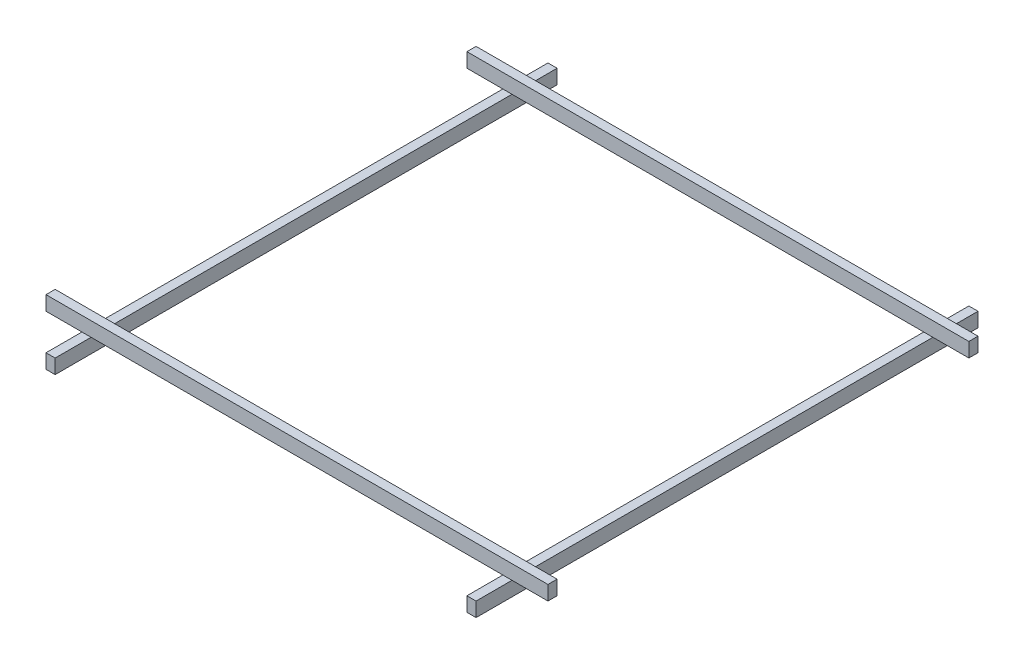
ISO-10303-21;
HEADER;
FILE_DESCRIPTION(('STEP AP214'),'2;1');
FILE_NAME('part.step','',(''),(''),'','','');
FILE_SCHEMA(('AUTOMOTIVE_DESIGN { 1 0 10303 214 1 1 1 1 }'));
ENDSEC;
DATA;
#1=APPLICATION_CONTEXT('core data for automotive mechanical design processes');
#2=APPLICATION_PROTOCOL_DEFINITION('international standard','automotive_design',2000,#1);
#3=PRODUCT_CONTEXT('',#1,'mechanical');
#4=PRODUCT('Part','Part','',(#3));
#5=PRODUCT_RELATED_PRODUCT_CATEGORY('part','',(#4));
#6=PRODUCT_DEFINITION_FORMATION('','',#4);
#7=PRODUCT_DEFINITION_CONTEXT('part definition',#1,'design');
#8=PRODUCT_DEFINITION('design','',#6,#7);
#9=PRODUCT_DEFINITION_SHAPE('','',#8);
#10=(LENGTH_UNIT() NAMED_UNIT(*) SI_UNIT(.MILLI.,.METRE.));
#11=(NAMED_UNIT(*) PLANE_ANGLE_UNIT() SI_UNIT($,.RADIAN.));
#12=(NAMED_UNIT(*) SI_UNIT($,.STERADIAN.) SOLID_ANGLE_UNIT());
#13=UNCERTAINTY_MEASURE_WITH_UNIT(LENGTH_MEASURE(1.E-05),#10,'distance_accuracy_value','');
#14=(GEOMETRIC_REPRESENTATION_CONTEXT(3) GLOBAL_UNCERTAINTY_ASSIGNED_CONTEXT((#13)) GLOBAL_UNIT_ASSIGNED_CONTEXT((#10,
#11,#12)) REPRESENTATION_CONTEXT('',''));
#15=CARTESIAN_POINT('',(0.,0.,0.));
#16=DIRECTION('',(0.,0.,1.));
#17=DIRECTION('',(1.,0.,0.));
#18=AXIS2_PLACEMENT_3D('',#15,#16,#17);
#19=CARTESIAN_POINT('',(4572.,209.55,-438.15));
#20=DIRECTION('',(0.,0.,1.));
#21=DIRECTION('',(0.,-1.,0.));
#22=AXIS2_PLACEMENT_3D('',#19,#20,#21);
#23=PLANE('',#22);
#24=DIRECTION('',(0.,1.,0.));
#25=VECTOR('',#24,1.);
#26=CARTESIAN_POINT('',(-304.8,209.55,-438.15));
#27=LINE('',#26,#25);
#28=CARTESIAN_POINT('',(-304.8,69.85,-438.15));
#29=VERTEX_POINT('',#28);
#30=CARTESIAN_POINT('',(-304.8,209.55,-438.15));
#31=VERTEX_POINT('',#30);
#32=EDGE_CURVE('E135',#29,#31,#27,.T.);
#33=ORIENTED_EDGE('',*,*,#32,.T.);
#34=DIRECTION('',(-1.,0.,0.));
#35=VECTOR('',#34,1.);
#36=CARTESIAN_POINT('',(4572.,209.55,-438.15));
#37=LINE('',#36,#35);
#38=CARTESIAN_POINT('',(4572.,209.55,-438.15));
#39=VERTEX_POINT('',#38);
#40=EDGE_CURVE('E13',#39,#31,#37,.T.);
#41=ORIENTED_EDGE('',*,*,#40,.F.);
#42=DIRECTION('',(0.,1.,0.));
#43=VECTOR('',#42,1.);
#44=CARTESIAN_POINT('',(4572.,209.55,-438.15));
#45=LINE('',#44,#43);
#46=CARTESIAN_POINT('',(4572.,69.85,-438.15));
#47=VERTEX_POINT('',#46);
#48=EDGE_CURVE('E123',#47,#39,#45,.T.);
#49=ORIENTED_EDGE('',*,*,#48,.F.);
#50=DIRECTION('',(-1.,0.,0.));
#51=VECTOR('',#50,1.);
#52=CARTESIAN_POINT('',(4572.,69.85,-438.15));
#53=LINE('',#52,#51);
#54=EDGE_CURVE('E131',#47,#29,#53,.T.);
#55=ORIENTED_EDGE('',*,*,#54,.T.);
#56=EDGE_LOOP('',(#33,#41,#49,#55));
#57=FACE_BOUND('',#56,.T.);
#58=ADVANCED_FACE('F72',(#57),#23,.F.);
#59=CARTESIAN_POINT('',(4572.,209.55,-349.25));
#60=DIRECTION('',(0.,-1.,0.));
#61=DIRECTION('',(0.,0.,-1.));
#62=AXIS2_PLACEMENT_3D('',#59,#60,#61);
#63=PLANE('',#62);
#64=DIRECTION('',(0.,0.,1.));
#65=VECTOR('',#64,1.);
#66=CARTESIAN_POINT('',(-304.8,209.55,-349.25));
#67=LINE('',#66,#65);
#68=CARTESIAN_POINT('',(-304.8,209.55,-349.25));
#69=VERTEX_POINT('',#68);
#70=EDGE_CURVE('E127',#31,#69,#67,.T.);
#71=ORIENTED_EDGE('',*,*,#70,.T.);
#72=DIRECTION('',(-1.,0.,0.));
#73=VECTOR('',#72,1.);
#74=CARTESIAN_POINT('',(4572.,209.55,-349.25));
#75=LINE('',#74,#73);
#76=CARTESIAN_POINT('',(4572.,209.55,-349.25));
#77=VERTEX_POINT('',#76);
#78=EDGE_CURVE('E80',#77,#69,#75,.T.);
#79=ORIENTED_EDGE('',*,*,#78,.F.);
#80=DIRECTION('',(0.,0.,1.));
#81=VECTOR('',#80,1.);
#82=CARTESIAN_POINT('',(4572.,209.55,-349.25));
#83=LINE('',#82,#81);
#84=EDGE_CURVE('E118',#39,#77,#83,.T.);
#85=ORIENTED_EDGE('',*,*,#84,.F.);
#86=ORIENTED_EDGE('',*,*,#40,.T.);
#87=EDGE_LOOP('',(#71,#79,#85,#86));
#88=FACE_BOUND('',#87,.T.);
#89=ADVANCED_FACE('F126',(#88),#63,.F.);
#90=CARTESIAN_POINT('',(4572.,209.55,-349.25));
#91=DIRECTION('',(0.,0.,-1.));
#92=DIRECTION('',(-1.,0.,0.));
#93=AXIS2_PLACEMENT_3D('',#90,#91,#92);
#94=PLANE('',#93);
#95=DIRECTION('',(0.,-1.,0.));
#96=VECTOR('',#95,1.);
#97=CARTESIAN_POINT('',(-304.8,209.55,-349.25));
#98=LINE('',#97,#96);
#99=CARTESIAN_POINT('',(-304.8,69.85,-349.25));
#100=VERTEX_POINT('',#99);
#101=EDGE_CURVE('E105',#69,#100,#98,.T.);
#102=ORIENTED_EDGE('',*,*,#101,.T.);
#103=DIRECTION('',(-1.,0.,0.));
#104=VECTOR('',#103,1.);
#105=CARTESIAN_POINT('',(4572.,69.85,-349.25));
#106=LINE('',#105,#104);
#107=CARTESIAN_POINT('',(4572.,69.85,-349.25));
#108=VERTEX_POINT('',#107);
#109=EDGE_CURVE('E128',#108,#100,#106,.T.);
#110=ORIENTED_EDGE('',*,*,#109,.F.);
#111=DIRECTION('',(0.,-1.,0.));
#112=VECTOR('',#111,1.);
#113=CARTESIAN_POINT('',(4572.,209.55,-349.25));
#114=LINE('',#113,#112);
#115=EDGE_CURVE('E121',#77,#108,#114,.T.);
#116=ORIENTED_EDGE('',*,*,#115,.F.);
#117=ORIENTED_EDGE('',*,*,#78,.T.);
#118=EDGE_LOOP('',(#102,#110,#116,#117));
#119=FACE_BOUND('',#118,.T.);
#120=ADVANCED_FACE('F129',(#119),#94,.F.);
#121=CARTESIAN_POINT('',(4572.,69.85,-349.25));
#122=DIRECTION('',(0.,1.,0.));
#123=DIRECTION('',(0.,0.,1.));
#124=AXIS2_PLACEMENT_3D('',#121,#122,#123);
#125=PLANE('',#124);
#126=DIRECTION('',(0.,0.,-1.));
#127=VECTOR('',#126,1.);
#128=CARTESIAN_POINT('',(-304.8,69.85,-349.25));
#129=LINE('',#128,#127);
#130=EDGE_CURVE('E111',#100,#29,#129,.T.);
#131=ORIENTED_EDGE('',*,*,#130,.T.);
#132=ORIENTED_EDGE('',*,*,#54,.F.);
#133=DIRECTION('',(0.,0.,-1.));
#134=VECTOR('',#133,1.);
#135=CARTESIAN_POINT('',(4572.,69.85,-349.25));
#136=LINE('',#135,#134);
#137=EDGE_CURVE('E88',#108,#47,#136,.T.);
#138=ORIENTED_EDGE('',*,*,#137,.F.);
#139=ORIENTED_EDGE('',*,*,#109,.T.);
#140=EDGE_LOOP('',(#131,#132,#138,#139));
#141=FACE_BOUND('',#140,.T.);
#142=ADVANCED_FACE('F142',(#141),#125,.F.);
#143=CARTESIAN_POINT('',(4572.,139.7,-482.600000000001));
#144=DIRECTION('',(1.,0.,0.));
#145=DIRECTION('',(0.,0.,-1.));
#146=AXIS2_PLACEMENT_3D('',#143,#144,#145);
#147=PLANE('',#146);
#148=ORIENTED_EDGE('',*,*,#48,.T.);
#149=ORIENTED_EDGE('',*,*,#84,.T.);
#150=ORIENTED_EDGE('',*,*,#115,.T.);
#151=ORIENTED_EDGE('',*,*,#137,.T.);
#152=EDGE_LOOP('',(#148,#149,#150,#151));
#153=FACE_BOUND('',#152,.T.);
#154=ADVANCED_FACE('F119',(#153),#147,.T.);
#155=CARTESIAN_POINT('',(-304.8,139.7,-482.600000000001));
#156=DIRECTION('',(1.,0.,0.));
#157=DIRECTION('',(0.,0.,-1.));
#158=AXIS2_PLACEMENT_3D('',#155,#156,#157);
#159=PLANE('',#158);
#160=ORIENTED_EDGE('',*,*,#32,.F.);
#161=ORIENTED_EDGE('',*,*,#130,.F.);
#162=ORIENTED_EDGE('',*,*,#101,.F.);
#163=ORIENTED_EDGE('',*,*,#70,.F.);
#164=EDGE_LOOP('',(#160,#161,#162,#163));
#165=FACE_BOUND('',#164,.T.);
#166=ADVANCED_FACE('F145',(#165),#159,.F.);
#167=CLOSED_SHELL('',(#58,#89,#120,#142,#154,#166));
#168=MANIFOLD_SOLID_BREP('B2',#167);
#169=CARTESIAN_POINT('',(4572.,209.55,-4527.55));
#170=DIRECTION('',(0.,0.,1.));
#171=DIRECTION('',(0.,-1.,0.));
#172=AXIS2_PLACEMENT_3D('',#169,#170,#171);
#173=PLANE('',#172);
#174=DIRECTION('',(0.,1.,0.));
#175=VECTOR('',#174,1.);
#176=CARTESIAN_POINT('',(-304.8,209.55,-4527.55));
#177=LINE('',#176,#175);
#178=CARTESIAN_POINT('',(-304.8,69.85,-4527.55));
#179=VERTEX_POINT('',#178);
#180=CARTESIAN_POINT('',(-304.8,209.55,-4527.55));
#181=VERTEX_POINT('',#180);
#182=EDGE_CURVE('E295',#179,#181,#177,.T.);
#183=ORIENTED_EDGE('',*,*,#182,.T.);
#184=DIRECTION('',(-1.,0.,0.));
#185=VECTOR('',#184,1.);
#186=CARTESIAN_POINT('',(4572.,209.55,-4527.55));
#187=LINE('',#186,#185);
#188=CARTESIAN_POINT('',(4572.,209.55,-4527.55));
#189=VERTEX_POINT('',#188);
#190=EDGE_CURVE('E70',#189,#181,#187,.T.);
#191=ORIENTED_EDGE('',*,*,#190,.F.);
#192=DIRECTION('',(0.,1.,0.));
#193=VECTOR('',#192,1.);
#194=CARTESIAN_POINT('',(4572.,209.55,-4527.55));
#195=LINE('',#194,#193);
#196=CARTESIAN_POINT('',(4572.,69.85,-4527.55));
#197=VERTEX_POINT('',#196);
#198=EDGE_CURVE('E283',#197,#189,#195,.T.);
#199=ORIENTED_EDGE('',*,*,#198,.F.);
#200=DIRECTION('',(-1.,0.,0.));
#201=VECTOR('',#200,1.);
#202=CARTESIAN_POINT('',(4572.,69.85,-4527.55));
#203=LINE('',#202,#201);
#204=EDGE_CURVE('E291',#197,#179,#203,.T.);
#205=ORIENTED_EDGE('',*,*,#204,.T.);
#206=EDGE_LOOP('',(#183,#191,#199,#205));
#207=FACE_BOUND('',#206,.T.);
#208=ADVANCED_FACE('F230',(#207),#173,.F.);
#209=CARTESIAN_POINT('',(4572.,209.55,-4438.65));
#210=DIRECTION('',(0.,-1.,0.));
#211=DIRECTION('',(0.,0.,-1.));
#212=AXIS2_PLACEMENT_3D('',#209,#210,#211);
#213=PLANE('',#212);
#214=DIRECTION('',(0.,0.,1.));
#215=VECTOR('',#214,1.);
#216=CARTESIAN_POINT('',(-304.8,209.55,-4438.65));
#217=LINE('',#216,#215);
#218=CARTESIAN_POINT('',(-304.8,209.55,-4438.65));
#219=VERTEX_POINT('',#218);
#220=EDGE_CURVE('E287',#181,#219,#217,.T.);
#221=ORIENTED_EDGE('',*,*,#220,.T.);
#222=DIRECTION('',(-1.,0.,0.));
#223=VECTOR('',#222,1.);
#224=CARTESIAN_POINT('',(4572.,209.55,-4438.65));
#225=LINE('',#224,#223);
#226=CARTESIAN_POINT('',(4572.,209.55,-4438.65));
#227=VERTEX_POINT('',#226);
#228=EDGE_CURVE('E238',#227,#219,#225,.T.);
#229=ORIENTED_EDGE('',*,*,#228,.F.);
#230=DIRECTION('',(0.,0.,1.));
#231=VECTOR('',#230,1.);
#232=CARTESIAN_POINT('',(4572.,209.55,-4438.65));
#233=LINE('',#232,#231);
#234=EDGE_CURVE('E278',#189,#227,#233,.T.);
#235=ORIENTED_EDGE('',*,*,#234,.F.);
#236=ORIENTED_EDGE('',*,*,#190,.T.);
#237=EDGE_LOOP('',(#221,#229,#235,#236));
#238=FACE_BOUND('',#237,.T.);
#239=ADVANCED_FACE('F286',(#238),#213,.F.);
#240=CARTESIAN_POINT('',(4572.,209.55,-4438.65));
#241=DIRECTION('',(0.,0.,-1.));
#242=DIRECTION('',(-1.,0.,0.));
#243=AXIS2_PLACEMENT_3D('',#240,#241,#242);
#244=PLANE('',#243);
#245=DIRECTION('',(0.,-1.,0.));
#246=VECTOR('',#245,1.);
#247=CARTESIAN_POINT('',(-304.8,209.55,-4438.65));
#248=LINE('',#247,#246);
#249=CARTESIAN_POINT('',(-304.8,69.85,-4438.65));
#250=VERTEX_POINT('',#249);
#251=EDGE_CURVE('E265',#219,#250,#248,.T.);
#252=ORIENTED_EDGE('',*,*,#251,.T.);
#253=DIRECTION('',(-1.,0.,0.));
#254=VECTOR('',#253,1.);
#255=CARTESIAN_POINT('',(4572.,69.85,-4438.65));
#256=LINE('',#255,#254);
#257=CARTESIAN_POINT('',(4572.,69.85,-4438.65));
#258=VERTEX_POINT('',#257);
#259=EDGE_CURVE('E288',#258,#250,#256,.T.);
#260=ORIENTED_EDGE('',*,*,#259,.F.);
#261=DIRECTION('',(0.,-1.,0.));
#262=VECTOR('',#261,1.);
#263=CARTESIAN_POINT('',(4572.,209.55,-4438.65));
#264=LINE('',#263,#262);
#265=EDGE_CURVE('E281',#227,#258,#264,.T.);
#266=ORIENTED_EDGE('',*,*,#265,.F.);
#267=ORIENTED_EDGE('',*,*,#228,.T.);
#268=EDGE_LOOP('',(#252,#260,#266,#267));
#269=FACE_BOUND('',#268,.T.);
#270=ADVANCED_FACE('F289',(#269),#244,.F.);
#271=CARTESIAN_POINT('',(4572.,69.85,-4438.65));
#272=DIRECTION('',(0.,1.,0.));
#273=DIRECTION('',(0.,0.,1.));
#274=AXIS2_PLACEMENT_3D('',#271,#272,#273);
#275=PLANE('',#274);
#276=DIRECTION('',(0.,0.,-1.));
#277=VECTOR('',#276,1.);
#278=CARTESIAN_POINT('',(-304.8,69.85,-4438.65));
#279=LINE('',#278,#277);
#280=EDGE_CURVE('E271',#250,#179,#279,.T.);
#281=ORIENTED_EDGE('',*,*,#280,.T.);
#282=ORIENTED_EDGE('',*,*,#204,.F.);
#283=DIRECTION('',(0.,0.,-1.));
#284=VECTOR('',#283,1.);
#285=CARTESIAN_POINT('',(4572.,69.85,-4438.65));
#286=LINE('',#285,#284);
#287=EDGE_CURVE('E246',#258,#197,#286,.T.);
#288=ORIENTED_EDGE('',*,*,#287,.F.);
#289=ORIENTED_EDGE('',*,*,#259,.T.);
#290=EDGE_LOOP('',(#281,#282,#288,#289));
#291=FACE_BOUND('',#290,.T.);
#292=ADVANCED_FACE('F307',(#291),#275,.F.);
#293=CARTESIAN_POINT('',(4572.,139.7,-4572.));
#294=DIRECTION('',(1.,0.,0.));
#295=DIRECTION('',(0.,0.,-1.));
#296=AXIS2_PLACEMENT_3D('',#293,#294,#295);
#297=PLANE('',#296);
#298=ORIENTED_EDGE('',*,*,#198,.T.);
#299=ORIENTED_EDGE('',*,*,#234,.T.);
#300=ORIENTED_EDGE('',*,*,#265,.T.);
#301=ORIENTED_EDGE('',*,*,#287,.T.);
#302=EDGE_LOOP('',(#298,#299,#300,#301));
#303=FACE_BOUND('',#302,.T.);
#304=ADVANCED_FACE('F279',(#303),#297,.T.);
#305=CARTESIAN_POINT('',(-304.8,139.7,-4572.));
#306=DIRECTION('',(1.,0.,0.));
#307=DIRECTION('',(0.,0.,-1.));
#308=AXIS2_PLACEMENT_3D('',#305,#306,#307);
#309=PLANE('',#308);
#310=ORIENTED_EDGE('',*,*,#182,.F.);
#311=ORIENTED_EDGE('',*,*,#280,.F.);
#312=ORIENTED_EDGE('',*,*,#251,.F.);
#313=ORIENTED_EDGE('',*,*,#220,.F.);
#314=EDGE_LOOP('',(#310,#311,#312,#313));
#315=FACE_BOUND('',#314,.T.);
#316=ADVANCED_FACE('F310',(#315),#309,.F.);
#317=CLOSED_SHELL('',(#208,#239,#270,#292,#304,#316));
#318=MANIFOLD_SOLID_BREP('B7',#317);
#319=CARTESIAN_POINT('',(4133.85,69.85,-4876.8));
#320=DIRECTION('',(1.,0.,0.));
#321=DIRECTION('',(0.,1.,0.));
#322=AXIS2_PLACEMENT_3D('',#319,#320,#321);
#323=PLANE('',#322);
#324=DIRECTION('',(0.,1.,0.));
#325=VECTOR('',#324,1.);
#326=CARTESIAN_POINT('',(4133.85,69.85,0.));
#327=LINE('',#326,#325);
#328=CARTESIAN_POINT('',(4133.85,-69.85,0.));
#329=VERTEX_POINT('',#328);
#330=CARTESIAN_POINT('',(4133.85,69.85,0.));
#331=VERTEX_POINT('',#330);
#332=EDGE_CURVE('E459',#329,#331,#327,.T.);
#333=ORIENTED_EDGE('',*,*,#332,.T.);
#334=DIRECTION('',(0.,0.,1.));
#335=VECTOR('',#334,1.);
#336=CARTESIAN_POINT('',(4133.85,69.85,-4876.8));
#337=LINE('',#336,#335);
#338=CARTESIAN_POINT('',(4133.85,69.85,-4876.8));
#339=VERTEX_POINT('',#338);
#340=EDGE_CURVE('E228',#339,#331,#337,.T.);
#341=ORIENTED_EDGE('',*,*,#340,.F.);
#342=DIRECTION('',(0.,1.,0.));
#343=VECTOR('',#342,1.);
#344=CARTESIAN_POINT('',(4133.85,69.85,-4876.8));
#345=LINE('',#344,#343);
#346=CARTESIAN_POINT('',(4133.85,-69.85,-4876.8));
#347=VERTEX_POINT('',#346);
#348=EDGE_CURVE('E446',#347,#339,#345,.T.);
#349=ORIENTED_EDGE('',*,*,#348,.F.);
#350=DIRECTION('',(0.,0.,1.));
#351=VECTOR('',#350,1.);
#352=CARTESIAN_POINT('',(4133.85,-69.85,-4876.8));
#353=LINE('',#352,#351);
#354=EDGE_CURVE('E455',#347,#329,#353,.T.);
#355=ORIENTED_EDGE('',*,*,#354,.T.);
#356=EDGE_LOOP('',(#333,#341,#349,#355));
#357=FACE_BOUND('',#356,.T.);
#358=ADVANCED_FACE('F394',(#357),#323,.F.);
#359=CARTESIAN_POINT('',(4222.75,69.85,-4876.8));
#360=DIRECTION('',(0.,-1.,0.));
#361=DIRECTION('',(0.,0.,-1.));
#362=AXIS2_PLACEMENT_3D('',#359,#360,#361);
#363=PLANE('',#362);
#364=DIRECTION('',(1.,0.,0.));
#365=VECTOR('',#364,1.);
#366=CARTESIAN_POINT('',(4222.75,69.85,0.));
#367=LINE('',#366,#365);
#368=CARTESIAN_POINT('',(4222.75,69.85,0.));
#369=VERTEX_POINT('',#368);
#370=EDGE_CURVE('E450',#331,#369,#367,.T.);
#371=ORIENTED_EDGE('',*,*,#370,.T.);
#372=DIRECTION('',(0.,0.,1.));
#373=VECTOR('',#372,1.);
#374=CARTESIAN_POINT('',(4222.75,69.85,-4876.8));
#375=LINE('',#374,#373);
#376=CARTESIAN_POINT('',(4222.75,69.85,-4876.8));
#377=VERTEX_POINT('',#376);
#378=EDGE_CURVE('E403',#377,#369,#375,.T.);
#379=ORIENTED_EDGE('',*,*,#378,.F.);
#380=DIRECTION('',(1.,0.,0.));
#381=VECTOR('',#380,1.);
#382=CARTESIAN_POINT('',(4222.75,69.85,-4876.8));
#383=LINE('',#382,#381);
#384=EDGE_CURVE('E441',#339,#377,#383,.T.);
#385=ORIENTED_EDGE('',*,*,#384,.F.);
#386=ORIENTED_EDGE('',*,*,#340,.T.);
#387=EDGE_LOOP('',(#371,#379,#385,#386));
#388=FACE_BOUND('',#387,.T.);
#389=ADVANCED_FACE('F449',(#388),#363,.F.);
#390=CARTESIAN_POINT('',(4222.75,69.85,-4876.8));
#391=DIRECTION('',(-1.,0.,0.));
#392=DIRECTION('',(0.,0.,1.));
#393=AXIS2_PLACEMENT_3D('',#390,#391,#392);
#394=PLANE('',#393);
#395=DIRECTION('',(0.,-1.,0.));
#396=VECTOR('',#395,1.);
#397=CARTESIAN_POINT('',(4222.75,69.85,0.));
#398=LINE('',#397,#396);
#399=CARTESIAN_POINT('',(4222.75,-69.85,0.));
#400=VERTEX_POINT('',#399);
#401=EDGE_CURVE('E428',#369,#400,#398,.T.);
#402=ORIENTED_EDGE('',*,*,#401,.T.);
#403=DIRECTION('',(0.,0.,1.));
#404=VECTOR('',#403,1.);
#405=CARTESIAN_POINT('',(4222.75,-69.85,-4876.8));
#406=LINE('',#405,#404);
#407=CARTESIAN_POINT('',(4222.75,-69.85,-4876.8));
#408=VERTEX_POINT('',#407);
#409=EDGE_CURVE('E452',#408,#400,#406,.T.);
#410=ORIENTED_EDGE('',*,*,#409,.F.);
#411=DIRECTION('',(0.,-1.,0.));
#412=VECTOR('',#411,1.);
#413=CARTESIAN_POINT('',(4222.75,69.85,-4876.8));
#414=LINE('',#413,#412);
#415=EDGE_CURVE('E444',#377,#408,#414,.T.);
#416=ORIENTED_EDGE('',*,*,#415,.F.);
#417=ORIENTED_EDGE('',*,*,#378,.T.);
#418=EDGE_LOOP('',(#402,#410,#416,#417));
#419=FACE_BOUND('',#418,.T.);
#420=ADVANCED_FACE('F453',(#419),#394,.F.);
#421=CARTESIAN_POINT('',(4222.75,-69.85,-4876.8));
#422=DIRECTION('',(0.,1.,0.));
#423=DIRECTION('',(0.,0.,1.));
#424=AXIS2_PLACEMENT_3D('',#421,#422,#423);
#425=PLANE('',#424);
#426=DIRECTION('',(-1.,0.,0.));
#427=VECTOR('',#426,1.);
#428=CARTESIAN_POINT('',(4222.75,-69.85,0.));
#429=LINE('',#428,#427);
#430=EDGE_CURVE('E434',#400,#329,#429,.T.);
#431=ORIENTED_EDGE('',*,*,#430,.T.);
#432=ORIENTED_EDGE('',*,*,#354,.F.);
#433=DIRECTION('',(-1.,0.,0.));
#434=VECTOR('',#433,1.);
#435=CARTESIAN_POINT('',(4222.75,-69.85,-4876.8));
#436=LINE('',#435,#434);
#437=EDGE_CURVE('E411',#408,#347,#436,.T.);
#438=ORIENTED_EDGE('',*,*,#437,.F.);
#439=ORIENTED_EDGE('',*,*,#409,.T.);
#440=EDGE_LOOP('',(#431,#432,#438,#439));
#441=FACE_BOUND('',#440,.T.);
#442=ADVANCED_FACE('F468',(#441),#425,.F.);
#443=CARTESIAN_POINT('',(4089.4,0.,-4876.8));
#444=DIRECTION('',(0.,0.,-1.));
#445=DIRECTION('',(-1.,0.,0.));
#446=AXIS2_PLACEMENT_3D('',#443,#444,#445);
#447=PLANE('',#446);
#448=ORIENTED_EDGE('',*,*,#348,.T.);
#449=ORIENTED_EDGE('',*,*,#384,.T.);
#450=ORIENTED_EDGE('',*,*,#415,.T.);
#451=ORIENTED_EDGE('',*,*,#437,.T.);
#452=EDGE_LOOP('',(#448,#449,#450,#451));
#453=FACE_BOUND('',#452,.T.);
#454=ADVANCED_FACE('F442',(#453),#447,.T.);
#455=CARTESIAN_POINT('',(4089.4,0.,0.));
#456=DIRECTION('',(0.,0.,-1.));
#457=DIRECTION('',(-1.,0.,0.));
#458=AXIS2_PLACEMENT_3D('',#455,#456,#457);
#459=PLANE('',#458);
#460=ORIENTED_EDGE('',*,*,#332,.F.);
#461=ORIENTED_EDGE('',*,*,#430,.F.);
#462=ORIENTED_EDGE('',*,*,#401,.F.);
#463=ORIENTED_EDGE('',*,*,#370,.F.);
#464=EDGE_LOOP('',(#460,#461,#462,#463));
#465=FACE_BOUND('',#464,.T.);
#466=ADVANCED_FACE('F471',(#465),#459,.F.);
#467=CLOSED_SHELL('',(#358,#389,#420,#442,#454,#466));
#468=MANIFOLD_SOLID_BREP('B64',#467);
#469=CARTESIAN_POINT('',(44.4500000000002,69.85,-4876.8));
#470=DIRECTION('',(1.,0.,0.));
#471=DIRECTION('',(0.,1.,0.));
#472=AXIS2_PLACEMENT_3D('',#469,#470,#471);
#473=PLANE('',#472);
#474=DIRECTION('',(0.,1.,0.));
#475=VECTOR('',#474,1.);
#476=CARTESIAN_POINT('',(44.4500000000002,69.85,8.88178419700125E-13));
#477=LINE('',#476,#475);
#478=CARTESIAN_POINT('',(44.4500000000002,-69.85,8.88178419700125E-13));
#479=VERTEX_POINT('',#478);
#480=CARTESIAN_POINT('',(44.4500000000002,69.85,8.88178419700125E-13));
#481=VERTEX_POINT('',#480);
#482=EDGE_CURVE('E611',#479,#481,#477,.T.);
#483=ORIENTED_EDGE('',*,*,#482,.T.);
#484=DIRECTION('',(0.,0.,1.));
#485=VECTOR('',#484,1.);
#486=CARTESIAN_POINT('',(44.4500000000002,69.85,-4876.8));
#487=LINE('',#486,#485);
#488=CARTESIAN_POINT('',(44.4500000000002,69.85,-4876.8));
#489=VERTEX_POINT('',#488);
#490=EDGE_CURVE('E392',#489,#481,#487,.T.);
#491=ORIENTED_EDGE('',*,*,#490,.F.);
#492=DIRECTION('',(0.,1.,0.));
#493=VECTOR('',#492,1.);
#494=CARTESIAN_POINT('',(44.4500000000002,69.85,-4876.8));
#495=LINE('',#494,#493);
#496=CARTESIAN_POINT('',(44.4500000000002,-69.85,-4876.8));
#497=VERTEX_POINT('',#496);
#498=EDGE_CURVE('E598',#497,#489,#495,.T.);
#499=ORIENTED_EDGE('',*,*,#498,.F.);
#500=DIRECTION('',(0.,0.,1.));
#501=VECTOR('',#500,1.);
#502=CARTESIAN_POINT('',(44.4500000000002,-69.85,-4876.8));
#503=LINE('',#502,#501);
#504=EDGE_CURVE('E607',#497,#479,#503,.T.);
#505=ORIENTED_EDGE('',*,*,#504,.T.);
#506=EDGE_LOOP('',(#483,#491,#499,#505));
#507=FACE_BOUND('',#506,.T.);
#508=ADVANCED_FACE('F546',(#507),#473,.F.);
#509=CARTESIAN_POINT('',(133.35,69.85,-4876.8));
#510=DIRECTION('',(0.,-1.,0.));
#511=DIRECTION('',(0.,0.,-1.));
#512=AXIS2_PLACEMENT_3D('',#509,#510,#511);
#513=PLANE('',#512);
#514=DIRECTION('',(1.,0.,0.));
#515=VECTOR('',#514,1.);
#516=CARTESIAN_POINT('',(133.35,69.85,8.88178419700125E-13));
#517=LINE('',#516,#515);
#518=CARTESIAN_POINT('',(133.35,69.85,8.88178419700125E-13));
#519=VERTEX_POINT('',#518);
#520=EDGE_CURVE('E602',#481,#519,#517,.T.);
#521=ORIENTED_EDGE('',*,*,#520,.T.);
#522=DIRECTION('',(0.,0.,1.));
#523=VECTOR('',#522,1.);
#524=CARTESIAN_POINT('',(133.35,69.85,-4876.8));
#525=LINE('',#524,#523);
#526=CARTESIAN_POINT('',(133.35,69.85,-4876.8));
#527=VERTEX_POINT('',#526);
#528=EDGE_CURVE('E555',#527,#519,#525,.T.);
#529=ORIENTED_EDGE('',*,*,#528,.F.);
#530=DIRECTION('',(1.,0.,0.));
#531=VECTOR('',#530,1.);
#532=CARTESIAN_POINT('',(133.35,69.85,-4876.8));
#533=LINE('',#532,#531);
#534=EDGE_CURVE('E593',#489,#527,#533,.T.);
#535=ORIENTED_EDGE('',*,*,#534,.F.);
#536=ORIENTED_EDGE('',*,*,#490,.T.);
#537=EDGE_LOOP('',(#521,#529,#535,#536));
#538=FACE_BOUND('',#537,.T.);
#539=ADVANCED_FACE('F601',(#538),#513,.F.);
#540=CARTESIAN_POINT('',(133.35,69.85,-4876.8));
#541=DIRECTION('',(-1.,0.,0.));
#542=DIRECTION('',(0.,0.,1.));
#543=AXIS2_PLACEMENT_3D('',#540,#541,#542);
#544=PLANE('',#543);
#545=DIRECTION('',(0.,-1.,0.));
#546=VECTOR('',#545,1.);
#547=CARTESIAN_POINT('',(133.35,69.85,8.88178419700125E-13));
#548=LINE('',#547,#546);
#549=CARTESIAN_POINT('',(133.35,-69.85,8.88178419700125E-13));
#550=VERTEX_POINT('',#549);
#551=EDGE_CURVE('E580',#519,#550,#548,.T.);
#552=ORIENTED_EDGE('',*,*,#551,.T.);
#553=DIRECTION('',(0.,0.,1.));
#554=VECTOR('',#553,1.);
#555=CARTESIAN_POINT('',(133.35,-69.85,-4876.8));
#556=LINE('',#555,#554);
#557=CARTESIAN_POINT('',(133.35,-69.85,-4876.8));
#558=VERTEX_POINT('',#557);
#559=EDGE_CURVE('E604',#558,#550,#556,.T.);
#560=ORIENTED_EDGE('',*,*,#559,.F.);
#561=DIRECTION('',(0.,-1.,0.));
#562=VECTOR('',#561,1.);
#563=CARTESIAN_POINT('',(133.35,69.85,-4876.8));
#564=LINE('',#563,#562);
#565=EDGE_CURVE('E596',#527,#558,#564,.T.);
#566=ORIENTED_EDGE('',*,*,#565,.F.);
#567=ORIENTED_EDGE('',*,*,#528,.T.);
#568=EDGE_LOOP('',(#552,#560,#566,#567));
#569=FACE_BOUND('',#568,.T.);
#570=ADVANCED_FACE('F605',(#569),#544,.F.);
#571=CARTESIAN_POINT('',(133.35,-69.85,-4876.8));
#572=DIRECTION('',(0.,1.,0.));
#573=DIRECTION('',(0.,0.,1.));
#574=AXIS2_PLACEMENT_3D('',#571,#572,#573);
#575=PLANE('',#574);
#576=DIRECTION('',(-1.,0.,0.));
#577=VECTOR('',#576,1.);
#578=CARTESIAN_POINT('',(133.35,-69.85,8.88178419700125E-13));
#579=LINE('',#578,#577);
#580=EDGE_CURVE('E586',#550,#479,#579,.T.);
#581=ORIENTED_EDGE('',*,*,#580,.T.);
#582=ORIENTED_EDGE('',*,*,#504,.F.);
#583=DIRECTION('',(-1.,0.,0.));
#584=VECTOR('',#583,1.);
#585=CARTESIAN_POINT('',(133.35,-69.85,-4876.8));
#586=LINE('',#585,#584);
#587=EDGE_CURVE('E563',#558,#497,#586,.T.);
#588=ORIENTED_EDGE('',*,*,#587,.F.);
#589=ORIENTED_EDGE('',*,*,#559,.T.);
#590=EDGE_LOOP('',(#581,#582,#588,#589));
#591=FACE_BOUND('',#590,.T.);
#592=ADVANCED_FACE('F620',(#591),#575,.F.);
#593=CARTESIAN_POINT('',(0.,0.,-4876.8));
#594=DIRECTION('',(0.,0.,-1.));
#595=DIRECTION('',(-1.,0.,0.));
#596=AXIS2_PLACEMENT_3D('',#593,#594,#595);
#597=PLANE('',#596);
#598=ORIENTED_EDGE('',*,*,#498,.T.);
#599=ORIENTED_EDGE('',*,*,#534,.T.);
#600=ORIENTED_EDGE('',*,*,#565,.T.);
#601=ORIENTED_EDGE('',*,*,#587,.T.);
#602=EDGE_LOOP('',(#598,#599,#600,#601));
#603=FACE_BOUND('',#602,.T.);
#604=ADVANCED_FACE('F594',(#603),#597,.T.);
#605=CARTESIAN_POINT('',(0.,0.,8.88178419700125E-13));
#606=DIRECTION('',(0.,0.,-1.));
#607=DIRECTION('',(-1.,0.,0.));
#608=AXIS2_PLACEMENT_3D('',#605,#606,#607);
#609=PLANE('',#608);
#610=ORIENTED_EDGE('',*,*,#482,.F.);
#611=ORIENTED_EDGE('',*,*,#580,.F.);
#612=ORIENTED_EDGE('',*,*,#551,.F.);
#613=ORIENTED_EDGE('',*,*,#520,.F.);
#614=EDGE_LOOP('',(#610,#611,#612,#613));
#615=FACE_BOUND('',#614,.T.);
#616=ADVANCED_FACE('F623',(#615),#609,.F.);
#617=CLOSED_SHELL('',(#508,#539,#570,#592,#604,#616));
#618=MANIFOLD_SOLID_BREP('B222',#617);
#619=ADVANCED_BREP_SHAPE_REPRESENTATION('',(#18,#168,#318,#468,#618),#14);
#620=SHAPE_DEFINITION_REPRESENTATION(#9,#619);
ENDSEC;
END-ISO-10303-21;
